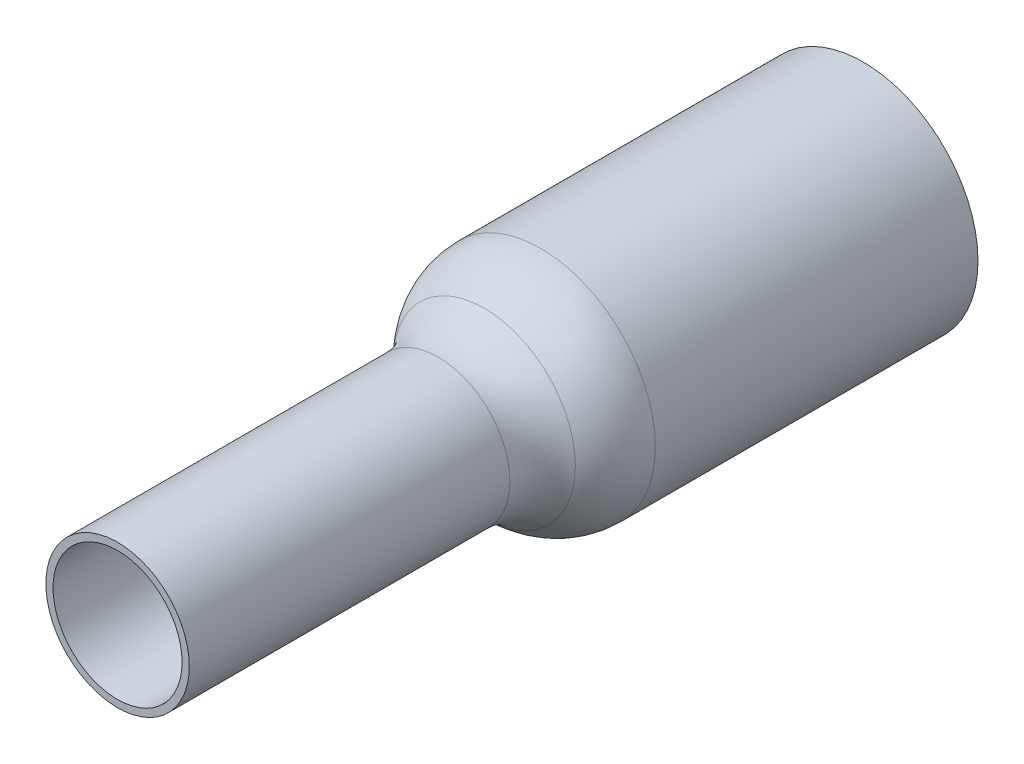
ISO-10303-21;
HEADER;
FILE_DESCRIPTION(('STEP AP214'),'2;1');
FILE_NAME('part.step','',(''),(''),'','','');
FILE_SCHEMA(('AUTOMOTIVE_DESIGN { 1 0 10303 214 1 1 1 1 }'));
ENDSEC;
DATA;
#1=APPLICATION_CONTEXT('core data for automotive mechanical design processes');
#2=APPLICATION_PROTOCOL_DEFINITION('international standard','automotive_design',2000,#1);
#3=PRODUCT_CONTEXT('',#1,'mechanical');
#4=PRODUCT('Part','Part','',(#3));
#5=PRODUCT_RELATED_PRODUCT_CATEGORY('part','',(#4));
#6=PRODUCT_DEFINITION_FORMATION('','',#4);
#7=PRODUCT_DEFINITION_CONTEXT('part definition',#1,'design');
#8=PRODUCT_DEFINITION('design','',#6,#7);
#9=PRODUCT_DEFINITION_SHAPE('','',#8);
#10=(LENGTH_UNIT() NAMED_UNIT(*) SI_UNIT(.MILLI.,.METRE.));
#11=(NAMED_UNIT(*) PLANE_ANGLE_UNIT() SI_UNIT($,.RADIAN.));
#12=(NAMED_UNIT(*) SI_UNIT($,.STERADIAN.) SOLID_ANGLE_UNIT());
#13=UNCERTAINTY_MEASURE_WITH_UNIT(LENGTH_MEASURE(1.E-05),#10,'distance_accuracy_value','');
#14=(GEOMETRIC_REPRESENTATION_CONTEXT(3) GLOBAL_UNCERTAINTY_ASSIGNED_CONTEXT((#13)) GLOBAL_UNIT_ASSIGNED_CONTEXT((#10,
#11,#12)) REPRESENTATION_CONTEXT('',''));
#15=CARTESIAN_POINT('',(0.,0.,0.));
#16=DIRECTION('',(0.,0.,1.));
#17=DIRECTION('',(1.,0.,0.));
#18=AXIS2_PLACEMENT_3D('',#15,#16,#17);
#19=CARTESIAN_POINT('',(0.,0.,0.));
#20=DIRECTION('',(0.,0.,1.));
#21=DIRECTION('',(1.,0.,0.));
#22=AXIS2_PLACEMENT_3D('',#19,#20,#21);
#23=CYLINDRICAL_SURFACE('',#22,1.5);
#24=CARTESIAN_POINT('',(0.,0.,-10.4));
#25=DIRECTION('',(0.,0.,1.));
#26=DIRECTION('',(1.,0.,0.));
#27=AXIS2_PLACEMENT_3D('',#24,#25,#26);
#28=CIRCLE('',#27,1.5);
#29=CARTESIAN_POINT('',(1.5,0.,-10.4));
#30=VERTEX_POINT('',#29);
#31=EDGE_CURVE('E10',#30,#30,#28,.T.);
#32=ORIENTED_EDGE('',*,*,#31,.F.);
#33=EDGE_LOOP('',(#32));
#34=FACE_BOUND('',#33,.T.);
#35=CARTESIAN_POINT('',(0.,0.,-5.9));
#36=DIRECTION('',(0.,0.,1.));
#37=DIRECTION('',(1.,0.,0.));
#38=AXIS2_PLACEMENT_3D('',#35,#36,#37);
#39=CIRCLE('',#38,1.5);
#40=CARTESIAN_POINT('',(1.5,0.,-5.9));
#41=VERTEX_POINT('',#40);
#42=EDGE_CURVE('E66',#41,#41,#39,.T.);
#43=ORIENTED_EDGE('',*,*,#42,.T.);
#44=EDGE_LOOP('',(#43));
#45=FACE_BOUND('',#44,.T.);
#46=ADVANCED_FACE('F32',(#34,#45),#23,.F.);
#47=CARTESIAN_POINT('',(0.,1.6,-10.4));
#48=DIRECTION('',(0.,0.,-1.));
#49=DIRECTION('',(-1.,0.,0.));
#50=AXIS2_PLACEMENT_3D('',#47,#48,#49);
#51=PLANE('',#50);
#52=ORIENTED_EDGE('',*,*,#31,.T.);
#53=EDGE_LOOP('',(#52));
#54=FACE_BOUND('',#53,.T.);
#55=CARTESIAN_POINT('',(0.,0.,-10.4));
#56=DIRECTION('',(0.,0.,1.));
#57=DIRECTION('',(1.,0.,0.));
#58=AXIS2_PLACEMENT_3D('',#55,#56,#57);
#59=CIRCLE('',#58,1.6);
#60=CARTESIAN_POINT('',(1.6,0.,-10.4));
#61=VERTEX_POINT('',#60);
#62=EDGE_CURVE('E38',#61,#61,#59,.T.);
#63=ORIENTED_EDGE('',*,*,#62,.F.);
#64=EDGE_LOOP('',(#63));
#65=FACE_BOUND('',#64,.T.);
#66=ADVANCED_FACE('F101',(#54,#65),#51,.T.);
#67=CARTESIAN_POINT('',(0.,0.,0.));
#68=DIRECTION('',(0.,0.,1.));
#69=DIRECTION('',(1.,0.,0.));
#70=AXIS2_PLACEMENT_3D('',#67,#68,#69);
#71=CYLINDRICAL_SURFACE('',#70,1.6);
#72=ORIENTED_EDGE('',*,*,#62,.T.);
#73=EDGE_LOOP('',(#72));
#74=FACE_BOUND('',#73,.T.);
#75=CARTESIAN_POINT('',(0.,0.,-5.9));
#76=DIRECTION('',(0.,0.,1.));
#77=DIRECTION('',(1.,0.,0.));
#78=AXIS2_PLACEMENT_3D('',#75,#76,#77);
#79=CIRCLE('',#78,1.6);
#80=CARTESIAN_POINT('',(1.6,0.,-5.9));
#81=VERTEX_POINT('',#80);
#82=EDGE_CURVE('E42',#81,#81,#79,.T.);
#83=ORIENTED_EDGE('',*,*,#82,.F.);
#84=EDGE_LOOP('',(#83));
#85=FACE_BOUND('',#84,.T.);
#86=ADVANCED_FACE('F106',(#74,#85),#71,.T.);
#87=CARTESIAN_POINT('',(0.,0.,-5.9));
#88=DIRECTION('',(0.,0.,1.));
#89=DIRECTION('',(1.,0.,0.));
#90=AXIS2_PLACEMENT_3D('',#87,#88,#89);
#91=DEGENERATE_TOROIDAL_SURFACE('',#90,0.5,1.1,.T.);
#92=ORIENTED_EDGE('',*,*,#82,.T.);
#93=EDGE_LOOP('',(#92));
#94=FACE_BOUND('',#93,.T.);
#95=CARTESIAN_POINT('',(0.,0.,-5.11444287286028));
#96=DIRECTION('',(0.,0.,1.));
#97=DIRECTION('',(1.,0.,0.));
#98=AXIS2_PLACEMENT_3D('',#95,#96,#97);
#99=CIRCLE('',#98,1.27);
#100=CARTESIAN_POINT('',(1.27,0.,-5.11444287286028));
#101=VERTEX_POINT('',#100);
#102=EDGE_CURVE('E46',#101,#101,#99,.T.);
#103=ORIENTED_EDGE('',*,*,#102,.F.);
#104=EDGE_LOOP('',(#103));
#105=FACE_BOUND('',#104,.T.);
#106=ADVANCED_FACE('F110',(#94,#105),#91,.T.);
#107=CARTESIAN_POINT('',(0.,0.,-4.47171431429143));
#108=DIRECTION('',(0.,0.,1.));
#109=DIRECTION('',(1.,0.,0.));
#110=AXIS2_PLACEMENT_3D('',#107,#108,#109);
#111=TOROIDAL_SURFACE('',#110,1.9,0.9);
#112=ORIENTED_EDGE('',*,*,#102,.T.);
#113=EDGE_LOOP('',(#112));
#114=FACE_BOUND('',#113,.T.);
#115=CARTESIAN_POINT('',(0.,0.,-4.47171431429143));
#116=DIRECTION('',(0.,0.,1.));
#117=DIRECTION('',(1.,0.,0.));
#118=AXIS2_PLACEMENT_3D('',#115,#116,#117);
#119=CIRCLE('',#118,1.);
#120=CARTESIAN_POINT('',(1.,0.,-4.47171431429143));
#121=VERTEX_POINT('',#120);
#122=EDGE_CURVE('E51',#121,#121,#119,.T.);
#123=ORIENTED_EDGE('',*,*,#122,.F.);
#124=EDGE_LOOP('',(#123));
#125=FACE_BOUND('',#124,.T.);
#126=ADVANCED_FACE('F97',(#114,#125),#111,.F.);
#127=CARTESIAN_POINT('',(0.,0.,0.));
#128=DIRECTION('',(0.,0.,1.));
#129=DIRECTION('',(1.,0.,0.));
#130=AXIS2_PLACEMENT_3D('',#127,#128,#129);
#131=CYLINDRICAL_SURFACE('',#130,1.);
#132=ORIENTED_EDGE('',*,*,#122,.T.);
#133=EDGE_LOOP('',(#132));
#134=FACE_BOUND('',#133,.T.);
#135=CARTESIAN_POINT('',(0.,0.,0.));
#136=DIRECTION('',(0.,0.,1.));
#137=DIRECTION('',(1.,0.,0.));
#138=AXIS2_PLACEMENT_3D('',#135,#136,#137);
#139=CIRCLE('',#138,1.);
#140=CARTESIAN_POINT('',(1.,0.,0.));
#141=VERTEX_POINT('',#140);
#142=EDGE_CURVE('E54',#141,#141,#139,.T.);
#143=ORIENTED_EDGE('',*,*,#142,.F.);
#144=EDGE_LOOP('',(#143));
#145=FACE_BOUND('',#144,.T.);
#146=ADVANCED_FACE('F91',(#134,#145),#131,.T.);
#147=CARTESIAN_POINT('',(0.,0.9,0.));
#148=DIRECTION('',(0.,0.,1.));
#149=DIRECTION('',(1.,0.,0.));
#150=AXIS2_PLACEMENT_3D('',#147,#148,#149);
#151=PLANE('',#150);
#152=ORIENTED_EDGE('',*,*,#142,.T.);
#153=EDGE_LOOP('',(#152));
#154=FACE_BOUND('',#153,.T.);
#155=CARTESIAN_POINT('',(0.,0.,0.));
#156=DIRECTION('',(0.,0.,1.));
#157=DIRECTION('',(1.,0.,0.));
#158=AXIS2_PLACEMENT_3D('',#155,#156,#157);
#159=CIRCLE('',#158,0.9);
#160=CARTESIAN_POINT('',(0.9,0.,0.));
#161=VERTEX_POINT('',#160);
#162=EDGE_CURVE('E57',#161,#161,#159,.T.);
#163=ORIENTED_EDGE('',*,*,#162,.F.);
#164=EDGE_LOOP('',(#163));
#165=FACE_BOUND('',#164,.T.);
#166=ADVANCED_FACE('F86',(#154,#165),#151,.T.);
#167=CARTESIAN_POINT('',(0.,0.,0.));
#168=DIRECTION('',(0.,0.,1.));
#169=DIRECTION('',(1.,0.,0.));
#170=AXIS2_PLACEMENT_3D('',#167,#168,#169);
#171=CYLINDRICAL_SURFACE('',#170,0.9);
#172=CARTESIAN_POINT('',(0.,0.,-4.47171431429143));
#173=DIRECTION('',(0.,0.,1.));
#174=DIRECTION('',(1.,0.,0.));
#175=AXIS2_PLACEMENT_3D('',#172,#173,#174);
#176=CIRCLE('',#175,0.9);
#177=CARTESIAN_POINT('',(0.9,0.,-4.47171431429143));
#178=VERTEX_POINT('',#177);
#179=EDGE_CURVE('E60',#178,#178,#176,.T.);
#180=ORIENTED_EDGE('',*,*,#179,.F.);
#181=EDGE_LOOP('',(#180));
#182=FACE_BOUND('',#181,.T.);
#183=ORIENTED_EDGE('',*,*,#162,.T.);
#184=EDGE_LOOP('',(#183));
#185=FACE_BOUND('',#184,.T.);
#186=ADVANCED_FACE('F80',(#182,#185),#171,.F.);
#187=CARTESIAN_POINT('',(0.,0.,-4.47171431429143));
#188=DIRECTION('',(0.,0.,1.));
#189=DIRECTION('',(1.,0.,0.));
#190=AXIS2_PLACEMENT_3D('',#187,#188,#189);
#191=TOROIDAL_SURFACE('',#190,1.9,1.);
#192=CARTESIAN_POINT('',(0.,0.,-5.18585715714571));
#193=DIRECTION('',(0.,0.,1.));
#194=DIRECTION('',(1.,0.,0.));
#195=AXIS2_PLACEMENT_3D('',#192,#193,#194);
#196=CIRCLE('',#195,1.2);
#197=CARTESIAN_POINT('',(1.2,0.,-5.18585715714571));
#198=VERTEX_POINT('',#197);
#199=EDGE_CURVE('E63',#198,#198,#196,.T.);
#200=ORIENTED_EDGE('',*,*,#199,.F.);
#201=EDGE_LOOP('',(#200));
#202=FACE_BOUND('',#201,.T.);
#203=ORIENTED_EDGE('',*,*,#179,.T.);
#204=EDGE_LOOP('',(#203));
#205=FACE_BOUND('',#204,.T.);
#206=ADVANCED_FACE('F74',(#202,#205),#191,.T.);
#207=CARTESIAN_POINT('',(0.,0.,-5.9));
#208=DIRECTION('',(0.,0.,1.));
#209=DIRECTION('',(1.,0.,0.));
#210=AXIS2_PLACEMENT_3D('',#207,#208,#209);
#211=DEGENERATE_TOROIDAL_SURFACE('',#210,0.5,1.,.T.);
#212=ORIENTED_EDGE('',*,*,#42,.F.);
#213=EDGE_LOOP('',(#212));
#214=FACE_BOUND('',#213,.T.);
#215=ORIENTED_EDGE('',*,*,#199,.T.);
#216=EDGE_LOOP('',(#215));
#217=FACE_BOUND('',#216,.T.);
#218=ADVANCED_FACE('F71',(#214,#217),#211,.F.);
#219=CLOSED_SHELL('',(#46,#66,#86,#106,#126,#146,#166,#186,#206,#218));
#220=MANIFOLD_SOLID_BREP('B2',#219);
#221=ADVANCED_BREP_SHAPE_REPRESENTATION('',(#18,#220),#14);
#222=SHAPE_DEFINITION_REPRESENTATION(#9,#221);
ENDSEC;
END-ISO-10303-21;
